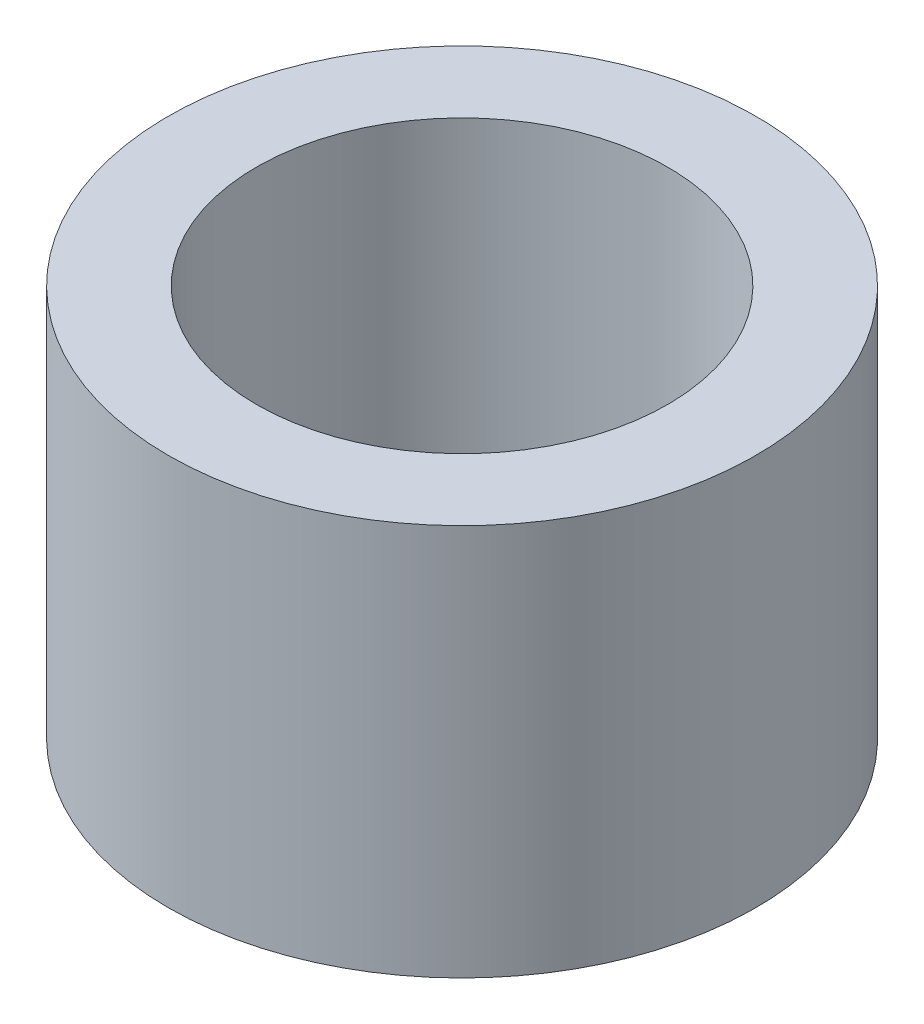
ISO-10303-21;
HEADER;
FILE_DESCRIPTION(('STEP AP214'),'2;1');
FILE_NAME('part.step','',(''),(''),'','','');
FILE_SCHEMA(('AUTOMOTIVE_DESIGN { 1 0 10303 214 1 1 1 1 }'));
ENDSEC;
DATA;
#1=APPLICATION_CONTEXT('core data for automotive mechanical design processes');
#2=APPLICATION_PROTOCOL_DEFINITION('international standard','automotive_design',2000,#1);
#3=PRODUCT_CONTEXT('',#1,'mechanical');
#4=PRODUCT('Part','Part','',(#3));
#5=PRODUCT_RELATED_PRODUCT_CATEGORY('part','',(#4));
#6=PRODUCT_DEFINITION_FORMATION('','',#4);
#7=PRODUCT_DEFINITION_CONTEXT('part definition',#1,'design');
#8=PRODUCT_DEFINITION('design','',#6,#7);
#9=PRODUCT_DEFINITION_SHAPE('','',#8);
#10=(LENGTH_UNIT() NAMED_UNIT(*) SI_UNIT(.MILLI.,.METRE.));
#11=(NAMED_UNIT(*) PLANE_ANGLE_UNIT() SI_UNIT($,.RADIAN.));
#12=(NAMED_UNIT(*) SI_UNIT($,.STERADIAN.) SOLID_ANGLE_UNIT());
#13=UNCERTAINTY_MEASURE_WITH_UNIT(LENGTH_MEASURE(1.E-05),#10,'distance_accuracy_value','');
#14=(GEOMETRIC_REPRESENTATION_CONTEXT(3) GLOBAL_UNCERTAINTY_ASSIGNED_CONTEXT((#13)) GLOBAL_UNIT_ASSIGNED_CONTEXT((#10,
#11,#12)) REPRESENTATION_CONTEXT('',''));
#15=CARTESIAN_POINT('',(0.,0.,0.));
#16=DIRECTION('',(0.,0.,1.));
#17=DIRECTION('',(1.,0.,0.));
#18=AXIS2_PLACEMENT_3D('',#15,#16,#17);
#19=CARTESIAN_POINT('',(0.,4.,0.));
#20=DIRECTION('',(0.,1.,0.));
#21=DIRECTION('',(0.,0.,1.));
#22=AXIS2_PLACEMENT_3D('',#19,#20,#21);
#23=PLANE('',#22);
#24=CARTESIAN_POINT('',(0.,4.,0.));
#25=DIRECTION('',(0.,1.,0.));
#26=DIRECTION('',(0.,0.,1.));
#27=AXIS2_PLACEMENT_3D('',#24,#25,#26);
#28=CIRCLE('',#27,3.);
#29=CARTESIAN_POINT('',(0.,4.,3.));
#30=VERTEX_POINT('',#29);
#31=EDGE_CURVE('E10',#30,#30,#28,.T.);
#32=ORIENTED_EDGE('',*,*,#31,.T.);
#33=EDGE_LOOP('',(#32));
#34=FACE_BOUND('',#33,.T.);
#35=CARTESIAN_POINT('',(0.,4.,0.));
#36=DIRECTION('',(0.,1.,0.));
#37=DIRECTION('',(0.,0.,1.));
#38=AXIS2_PLACEMENT_3D('',#35,#36,#37);
#39=CIRCLE('',#38,2.1);
#40=CARTESIAN_POINT('',(0.,4.,2.1));
#41=VERTEX_POINT('',#40);
#42=EDGE_CURVE('E44',#41,#41,#39,.T.);
#43=ORIENTED_EDGE('',*,*,#42,.F.);
#44=EDGE_LOOP('',(#43));
#45=FACE_BOUND('',#44,.T.);
#46=ADVANCED_FACE('F33',(#34,#45),#23,.T.);
#47=CARTESIAN_POINT('',(0.,0.,0.));
#48=DIRECTION('',(0.,1.,0.));
#49=DIRECTION('',(0.,0.,1.));
#50=AXIS2_PLACEMENT_3D('',#47,#48,#49);
#51=PLANE('',#50);
#52=CARTESIAN_POINT('',(0.,0.,0.));
#53=DIRECTION('',(0.,1.,0.));
#54=DIRECTION('',(0.,0.,1.));
#55=AXIS2_PLACEMENT_3D('',#52,#53,#54);
#56=CIRCLE('',#55,3.);
#57=CARTESIAN_POINT('',(0.,0.,3.));
#58=VERTEX_POINT('',#57);
#59=EDGE_CURVE('E37',#58,#58,#56,.T.);
#60=ORIENTED_EDGE('',*,*,#59,.F.);
#61=EDGE_LOOP('',(#60));
#62=FACE_BOUND('',#61,.T.);
#63=CARTESIAN_POINT('',(0.,0.,0.));
#64=DIRECTION('',(0.,1.,0.));
#65=DIRECTION('',(0.,0.,1.));
#66=AXIS2_PLACEMENT_3D('',#63,#64,#65);
#67=CIRCLE('',#66,2.1);
#68=CARTESIAN_POINT('',(0.,0.,2.1));
#69=VERTEX_POINT('',#68);
#70=EDGE_CURVE('E46',#69,#69,#67,.T.);
#71=ORIENTED_EDGE('',*,*,#70,.T.);
#72=EDGE_LOOP('',(#71));
#73=FACE_BOUND('',#72,.T.);
#74=ADVANCED_FACE('F56',(#62,#73),#51,.F.);
#75=CARTESIAN_POINT('',(0.,4.,0.));
#76=DIRECTION('',(0.,-1.,0.));
#77=DIRECTION('',(0.,0.,-1.));
#78=AXIS2_PLACEMENT_3D('',#75,#76,#77);
#79=CYLINDRICAL_SURFACE('',#78,3.);
#80=ORIENTED_EDGE('',*,*,#31,.F.);
#81=EDGE_LOOP('',(#80));
#82=FACE_BOUND('',#81,.T.);
#83=ORIENTED_EDGE('',*,*,#59,.T.);
#84=EDGE_LOOP('',(#83));
#85=FACE_BOUND('',#84,.T.);
#86=ADVANCED_FACE('F35',(#82,#85),#79,.T.);
#87=CARTESIAN_POINT('',(0.,4.,0.));
#88=DIRECTION('',(0.,-1.,0.));
#89=DIRECTION('',(0.,0.,-1.));
#90=AXIS2_PLACEMENT_3D('',#87,#88,#89);
#91=CYLINDRICAL_SURFACE('',#90,2.1);
#92=ORIENTED_EDGE('',*,*,#42,.T.);
#93=EDGE_LOOP('',(#92));
#94=FACE_BOUND('',#93,.T.);
#95=ORIENTED_EDGE('',*,*,#70,.F.);
#96=EDGE_LOOP('',(#95));
#97=FACE_BOUND('',#96,.T.);
#98=ADVANCED_FACE('F52',(#94,#97),#91,.F.);
#99=CLOSED_SHELL('',(#46,#74,#86,#98));
#100=MANIFOLD_SOLID_BREP('B2',#99);
#101=ADVANCED_BREP_SHAPE_REPRESENTATION('',(#18,#100),#14);
#102=SHAPE_DEFINITION_REPRESENTATION(#9,#101);
ENDSEC;
END-ISO-10303-21;
